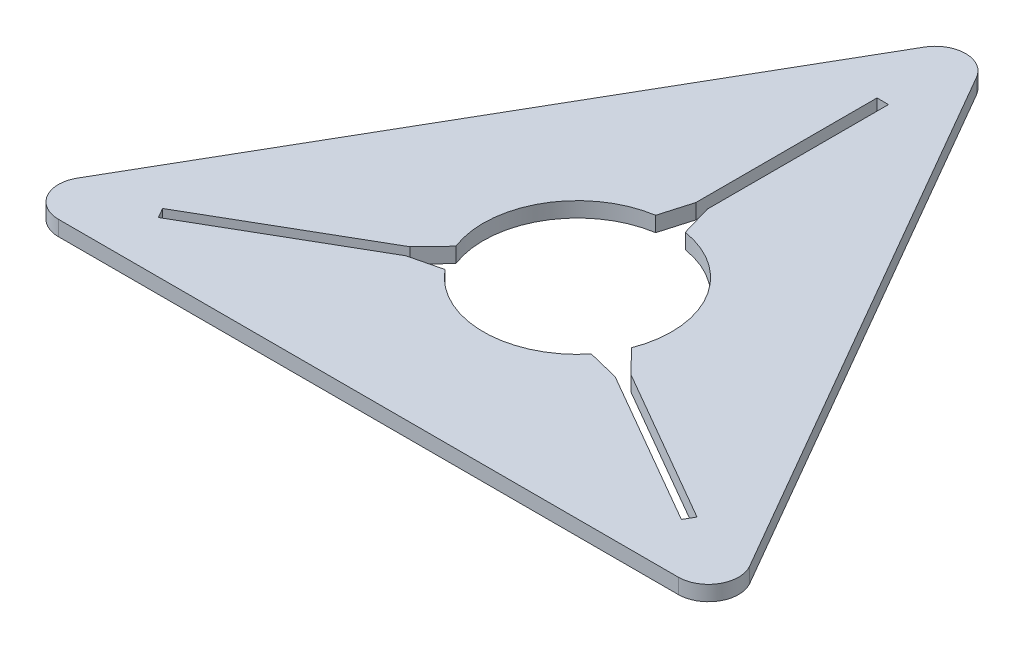
ISO-10303-21;
HEADER;
FILE_DESCRIPTION(('STEP AP214'),'2;1');
FILE_NAME('part.step','',(''),(''),'','','');
FILE_SCHEMA(('AUTOMOTIVE_DESIGN { 1 0 10303 214 1 1 1 1 }'));
ENDSEC;
DATA;
#1=APPLICATION_CONTEXT('core data for automotive mechanical design processes');
#2=APPLICATION_PROTOCOL_DEFINITION('international standard','automotive_design',2000,#1);
#3=PRODUCT_CONTEXT('',#1,'mechanical');
#4=PRODUCT('Part','Part','',(#3));
#5=PRODUCT_RELATED_PRODUCT_CATEGORY('part','',(#4));
#6=PRODUCT_DEFINITION_FORMATION('','',#4);
#7=PRODUCT_DEFINITION_CONTEXT('part definition',#1,'design');
#8=PRODUCT_DEFINITION('design','',#6,#7);
#9=PRODUCT_DEFINITION_SHAPE('','',#8);
#10=(LENGTH_UNIT() NAMED_UNIT(*) SI_UNIT(.MILLI.,.METRE.));
#11=(NAMED_UNIT(*) PLANE_ANGLE_UNIT() SI_UNIT($,.RADIAN.));
#12=(NAMED_UNIT(*) SI_UNIT($,.STERADIAN.) SOLID_ANGLE_UNIT());
#13=UNCERTAINTY_MEASURE_WITH_UNIT(LENGTH_MEASURE(1.E-05),#10,'distance_accuracy_value','');
#14=(GEOMETRIC_REPRESENTATION_CONTEXT(3) GLOBAL_UNCERTAINTY_ASSIGNED_CONTEXT((#13)) GLOBAL_UNIT_ASSIGNED_CONTEXT((#10,
#11,#12)) REPRESENTATION_CONTEXT('',''));
#15=CARTESIAN_POINT('',(0.,0.,0.));
#16=DIRECTION('',(0.,0.,1.));
#17=DIRECTION('',(1.,0.,0.));
#18=AXIS2_PLACEMENT_3D('',#15,#16,#17);
#19=CARTESIAN_POINT('',(0.,6.35,12.3986926256643));
#20=DIRECTION('',(0.,0.,1.));
#21=DIRECTION('',(1.,0.,0.));
#22=AXIS2_PLACEMENT_3D('',#19,#20,#21);
#23=PLANE('',#22);
#24=DIRECTION('',(-1.,0.,0.));
#25=VECTOR('',#24,1.);
#26=CARTESIAN_POINT('',(0.,0.,12.3986926256643));
#27=LINE('',#26,#25);
#28=CARTESIAN_POINT('',(205.250347928445,0.,12.3986926256643));
#29=VERTEX_POINT('',#28);
#30=CARTESIAN_POINT('',(-55.555561559305,0.,12.3986926256643));
#31=VERTEX_POINT('',#30);
#32=EDGE_CURVE('E347',#29,#31,#27,.T.);
#33=ORIENTED_EDGE('',*,*,#32,.F.);
#34=DIRECTION('',(0.,-1.,0.));
#35=VECTOR('',#34,1.);
#36=CARTESIAN_POINT('',(205.250347928445,6.35,12.3986926256643));
#37=LINE('',#36,#35);
#38=CARTESIAN_POINT('',(205.250347928445,6.35,12.3986926256643));
#39=VERTEX_POINT('',#38);
#40=EDGE_CURVE('E11',#29,#39,#37,.F.);
#41=ORIENTED_EDGE('',*,*,#40,.T.);
#42=DIRECTION('',(-1.,0.,0.));
#43=VECTOR('',#42,1.);
#44=CARTESIAN_POINT('',(0.,6.35,12.3986926256643));
#45=LINE('',#44,#43);
#46=CARTESIAN_POINT('',(-55.555561559305,6.35,12.3986926256643));
#47=VERTEX_POINT('',#46);
#48=EDGE_CURVE('E281',#39,#47,#45,.T.);
#49=ORIENTED_EDGE('',*,*,#48,.T.);
#50=DIRECTION('',(0.,-1.,0.));
#51=VECTOR('',#50,1.);
#52=CARTESIAN_POINT('',(-55.555561559305,6.35,12.3986926256643));
#53=LINE('',#52,#51);
#54=EDGE_CURVE('E54',#47,#31,#53,.T.);
#55=ORIENTED_EDGE('',*,*,#54,.T.);
#56=EDGE_LOOP('',(#33,#41,#49,#55));
#57=FACE_BOUND('',#56,.T.);
#58=ADVANCED_FACE('F45',(#57),#23,.T.);
#59=CARTESIAN_POINT('',(165.066753494658,6.35,-95.3013345643981));
#60=DIRECTION('',(0.866025403784439,0.,-0.5));
#61=DIRECTION('',(-0.5,0.,-0.866025403784439));
#62=AXIS2_PLACEMENT_3D('',#59,#60,#61);
#63=PLANE('',#62);
#64=DIRECTION('',(0.5,0.,0.866025403784439));
#65=VECTOR('',#64,1.);
#66=CARTESIAN_POINT('',(165.066753494658,0.,-95.3013345643981));
#67=LINE('',#66,#65);
#68=CARTESIAN_POINT('',(85.8459158126333,0.,-232.515850447831));
#69=VERTEX_POINT('',#68);
#70=CARTESIAN_POINT('',(216.248870556508,0.,-6.65130737433565));
#71=VERTEX_POINT('',#70);
#72=EDGE_CURVE('E351',#69,#71,#67,.T.);
#73=ORIENTED_EDGE('',*,*,#72,.F.);
#74=DIRECTION('',(0.,-1.,0.));
#75=VECTOR('',#74,1.);
#76=CARTESIAN_POINT('',(85.8459158126333,6.35,-232.515850447831));
#77=LINE('',#76,#75);
#78=CARTESIAN_POINT('',(85.8459158126333,6.35,-232.515850447831));
#79=VERTEX_POINT('',#78);
#80=EDGE_CURVE('E435',#69,#79,#77,.F.);
#81=ORIENTED_EDGE('',*,*,#80,.T.);
#82=DIRECTION('',(0.5,0.,0.866025403784439));
#83=VECTOR('',#82,1.);
#84=CARTESIAN_POINT('',(165.066753494658,6.35,-95.3013345643981));
#85=LINE('',#84,#83);
#86=CARTESIAN_POINT('',(216.248870556508,6.35,-6.65130737433565));
#87=VERTEX_POINT('',#86);
#88=EDGE_CURVE('E284',#79,#87,#85,.T.);
#89=ORIENTED_EDGE('',*,*,#88,.T.);
#90=DIRECTION('',(0.,-1.,0.));
#91=VECTOR('',#90,1.);
#92=CARTESIAN_POINT('',(216.248870556508,6.35,-6.65130737433567));
#93=LINE('',#92,#91);
#94=EDGE_CURVE('E431',#87,#71,#93,.T.);
#95=ORIENTED_EDGE('',*,*,#94,.T.);
#96=EDGE_LOOP('',(#73,#81,#89,#95));
#97=FACE_BOUND('',#96,.T.);
#98=ADVANCED_FACE('F458',(#97),#63,.T.);
#99=CARTESIAN_POINT('',(74.8473931845707,6.35,-75.5894883988338));
#100=DIRECTION('',(0.,-1.,0.));
#101=DIRECTION('',(0.,0.,-1.));
#102=AXIS2_PLACEMENT_3D('',#99,#100,#101);
#103=CYLINDRICAL_SURFACE('',#102,39.624);
#104=CARTESIAN_POINT('',(74.8473931845707,0.,-75.5894883988338));
#105=DIRECTION('',(0.,1.,0.));
#106=DIRECTION('',(0.,0.,1.));
#107=AXIS2_PLACEMENT_3D('',#104,#105,#106);
#108=CIRCLE('',#107,39.624);
#109=CARTESIAN_POINT('',(111.848445191791,0.,-61.4126225125013));
#110=VERTEX_POINT('',#109);
#111=CARTESIAN_POINT('',(81.0703931845701,0.,-114.721772347001));
#112=VERTEX_POINT('',#111);
#113=EDGE_CURVE('E212',#110,#112,#108,.T.);
#114=ORIENTED_EDGE('',*,*,#113,.F.);
#115=DIRECTION('',(0.,-1.,0.));
#116=VECTOR('',#115,1.);
#117=CARTESIAN_POINT('',(111.848445191791,6.35,-61.4126225125013));
#118=LINE('',#117,#116);
#119=CARTESIAN_POINT('',(111.848445191791,6.35,-61.4126225125013));
#120=VERTEX_POINT('',#119);
#121=EDGE_CURVE('E207',#120,#110,#118,.T.);
#122=ORIENTED_EDGE('',*,*,#121,.F.);
#123=CARTESIAN_POINT('',(74.8473931845707,6.35,-75.5894883988338));
#124=DIRECTION('',(0.,1.,0.));
#125=DIRECTION('',(0.,0.,1.));
#126=AXIS2_PLACEMENT_3D('',#123,#124,#125);
#127=CIRCLE('',#126,39.624);
#128=CARTESIAN_POINT('',(81.0703931845701,6.35,-114.721772347001));
#129=VERTEX_POINT('',#128);
#130=EDGE_CURVE('E210',#120,#129,#127,.T.);
#131=ORIENTED_EDGE('',*,*,#130,.T.);
#132=DIRECTION('',(0.,-1.,0.));
#133=VECTOR('',#132,1.);
#134=CARTESIAN_POINT('',(81.0703931845701,6.35,-114.721772347001));
#135=LINE('',#134,#133);
#136=EDGE_CURVE('E292',#129,#112,#135,.T.);
#137=ORIENTED_EDGE('',*,*,#136,.T.);
#138=EDGE_LOOP('',(#114,#122,#131,#137));
#139=FACE_BOUND('',#138,.T.);
#140=ADVANCED_FACE('F209',(#139),#103,.F.);
#141=CARTESIAN_POINT('',(88.9363889257709,6.35,-85.3011196003562));
#142=DIRECTION('',(-0.721702705632083,0.,0.692203152754544));
#143=DIRECTION('',(0.692203152754544,0.,0.721702705632083));
#144=AXIS2_PLACEMENT_3D('',#141,#142,#143);
#145=PLANE('',#144);
#146=DIRECTION('',(-0.692203152754544,0.,-0.721702705632083));
#147=VECTOR('',#146,1.);
#148=CARTESIAN_POINT('',(88.9363889257709,0.,-85.3011196003562));
#149=LINE('',#148,#147);
#150=CARTESIAN_POINT('',(121.304118036757,0.,-51.5539781988656));
#151=VERTEX_POINT('',#150);
#152=EDGE_CURVE('E295',#151,#110,#149,.T.);
#153=ORIENTED_EDGE('',*,*,#152,.F.);
#154=DIRECTION('',(0.,-1.,0.));
#155=VECTOR('',#154,1.);
#156=CARTESIAN_POINT('',(121.304118036757,6.35,-51.5539781988656));
#157=LINE('',#156,#155);
#158=CARTESIAN_POINT('',(121.304118036757,6.35,-51.5539781988656));
#159=VERTEX_POINT('',#158);
#160=EDGE_CURVE('E219',#159,#151,#157,.T.);
#161=ORIENTED_EDGE('',*,*,#160,.F.);
#162=DIRECTION('',(-0.692203152754544,0.,-0.721702705632083));
#163=VECTOR('',#162,1.);
#164=CARTESIAN_POINT('',(88.9363889257709,6.35,-85.3011196003562));
#165=LINE('',#164,#163);
#166=EDGE_CURVE('E224',#159,#120,#165,.T.);
#167=ORIENTED_EDGE('',*,*,#166,.T.);
#168=ORIENTED_EDGE('',*,*,#121,.T.);
#169=EDGE_LOOP('',(#153,#161,#167,#168));
#170=FACE_BOUND('',#169,.T.);
#171=ADVANCED_FACE('F233',(#170),#145,.T.);
#172=CARTESIAN_POINT('',(52.6495569023733,6.35,-91.1917075508982));
#173=DIRECTION('',(0.500000000000004,0.,-0.866025403784436));
#174=DIRECTION('',(-0.866025403784436,0.,-0.500000000000004));
#175=AXIS2_PLACEMENT_3D('',#172,#173,#174);
#176=PLANE('',#175);
#177=DIRECTION('',(0.866025403784436,0.,0.500000000000004));
#178=VECTOR('',#177,1.);
#179=CARTESIAN_POINT('',(52.6495569023733,0.,-91.1917075508982));
#180=LINE('',#179,#178);
#181=CARTESIAN_POINT('',(187.295253805131,0.,-13.4539781988654));
#182=VERTEX_POINT('',#181);
#183=EDGE_CURVE('E300',#151,#182,#180,.T.);
#184=ORIENTED_EDGE('',*,*,#183,.T.);
#185=DIRECTION('',(0.,-1.,0.));
#186=VECTOR('',#185,1.);
#187=CARTESIAN_POINT('',(187.295253805131,6.35,-13.4539781988654));
#188=LINE('',#187,#186);
#189=CARTESIAN_POINT('',(187.295253805131,6.35,-13.4539781988654));
#190=VERTEX_POINT('',#189);
#191=EDGE_CURVE('E410',#190,#182,#188,.T.);
#192=ORIENTED_EDGE('',*,*,#191,.F.);
#193=DIRECTION('',(0.866025403784436,0.,0.500000000000004));
#194=VECTOR('',#193,1.);
#195=CARTESIAN_POINT('',(52.6495569023733,6.35,-91.1917075508982));
#196=LINE('',#195,#194);
#197=EDGE_CURVE('E236',#159,#190,#196,.T.);
#198=ORIENTED_EDGE('',*,*,#197,.F.);
#199=ORIENTED_EDGE('',*,*,#160,.T.);
#200=EDGE_LOOP('',(#184,#192,#198,#199));
#201=FACE_BOUND('',#200,.T.);
#202=ADVANCED_FACE('F536',(#201),#176,.F.);
#203=CARTESIAN_POINT('',(134.645696902758,6.35,77.7377293520326));
#204=DIRECTION('',(0.866025403784438,0.,0.500000000000002));
#205=DIRECTION('',(0.500000000000002,0.,-0.866025403784438));
#206=AXIS2_PLACEMENT_3D('',#203,#204,#205);
#207=PLANE('',#206);
#208=DIRECTION('',(-0.500000000000002,0.,0.866025403784438));
#209=VECTOR('',#208,1.);
#210=CARTESIAN_POINT('',(134.645696902758,0.,77.7377293520326));
#211=LINE('',#210,#209);
#212=CARTESIAN_POINT('',(184.882253805131,0.,-9.27453960020171));
#213=VERTEX_POINT('',#212);
#214=EDGE_CURVE('E303',#182,#213,#211,.T.);
#215=ORIENTED_EDGE('',*,*,#214,.T.);
#216=DIRECTION('',(0.,-1.,0.));
#217=VECTOR('',#216,1.);
#218=CARTESIAN_POINT('',(184.882253805131,6.35,-9.27453960020171));
#219=LINE('',#218,#217);
#220=CARTESIAN_POINT('',(184.882253805131,6.35,-9.27453960020171));
#221=VERTEX_POINT('',#220);
#222=EDGE_CURVE('E406',#221,#213,#219,.T.);
#223=ORIENTED_EDGE('',*,*,#222,.F.);
#224=DIRECTION('',(-0.500000000000002,0.,0.866025403784438));
#225=VECTOR('',#224,1.);
#226=CARTESIAN_POINT('',(134.645696902758,6.35,77.7377293520326));
#227=LINE('',#226,#225);
#228=EDGE_CURVE('E239',#190,#221,#227,.T.);
#229=ORIENTED_EDGE('',*,*,#228,.F.);
#230=ORIENTED_EDGE('',*,*,#191,.T.);
#231=EDGE_LOOP('',(#215,#223,#229,#230));
#232=FACE_BOUND('',#231,.T.);
#233=ADVANCED_FACE('F532',(#232),#207,.F.);
#234=CARTESIAN_POINT('',(50.2365569023733,6.35,-87.0122689522346));
#235=DIRECTION('',(-0.500000000000004,0.,0.866025403784436));
#236=DIRECTION('',(0.866025403784436,0.,0.500000000000004));
#237=AXIS2_PLACEMENT_3D('',#234,#235,#236);
#238=PLANE('',#237);
#239=DIRECTION('',(-0.866025403784436,0.,-0.500000000000004));
#240=VECTOR('',#239,1.);
#241=CARTESIAN_POINT('',(50.2365569023733,0.,-87.0122689522346));
#242=LINE('',#241,#240);
#243=CARTESIAN_POINT('',(118.891118036757,0.,-47.3745396002022));
#244=VERTEX_POINT('',#243);
#245=EDGE_CURVE('E306',#213,#244,#242,.T.);
#246=ORIENTED_EDGE('',*,*,#245,.T.);
#247=DIRECTION('',(0.,-1.,0.));
#248=VECTOR('',#247,1.);
#249=CARTESIAN_POINT('',(118.891118036757,6.35,-47.3745396002022));
#250=LINE('',#249,#248);
#251=CARTESIAN_POINT('',(118.891118036757,6.35,-47.3745396002022));
#252=VERTEX_POINT('',#251);
#253=EDGE_CURVE('E402',#252,#244,#250,.T.);
#254=ORIENTED_EDGE('',*,*,#253,.F.);
#255=DIRECTION('',(-0.866025403784436,0.,-0.500000000000004));
#256=VECTOR('',#255,1.);
#257=CARTESIAN_POINT('',(50.2365569023733,6.35,-87.0122689522346));
#258=LINE('',#257,#256);
#259=EDGE_CURVE('E244',#221,#252,#258,.T.);
#260=ORIENTED_EDGE('',*,*,#259,.F.);
#261=ORIENTED_EDGE('',*,*,#222,.T.);
#262=EDGE_LOOP('',(#246,#254,#260,#261));
#263=FACE_BOUND('',#262,.T.);
#264=ADVANCED_FACE('F528',(#263),#238,.F.);
#265=CARTESIAN_POINT('',(17.7469771314453,6.35,-72.2268361991639));
#266=DIRECTION('',(-0.238614162049086,0.,0.971114453434616));
#267=DIRECTION('',(0.971114453434616,0.,0.238614162049086));
#268=AXIS2_PLACEMENT_3D('',#265,#266,#267);
#269=PLANE('',#268);
#270=DIRECTION('',(-0.971114453434616,0.,-0.238614162049086));
#271=VECTOR('',#270,1.);
#272=CARTESIAN_POINT('',(17.7469771314453,0.,-72.2268361991639));
#273=LINE('',#272,#271);
#274=CARTESIAN_POINT('',(105.625445191791,0.,-50.6340703370002));
#275=VERTEX_POINT('',#274);
#276=EDGE_CURVE('E309',#244,#275,#273,.T.);
#277=ORIENTED_EDGE('',*,*,#276,.T.);
#278=DIRECTION('',(0.,-1.,0.));
#279=VECTOR('',#278,1.);
#280=CARTESIAN_POINT('',(105.625445191791,6.35,-50.6340703370002));
#281=LINE('',#280,#279);
#282=CARTESIAN_POINT('',(105.625445191791,6.35,-50.6340703370002));
#283=VERTEX_POINT('',#282);
#284=EDGE_CURVE('E399',#283,#275,#281,.T.);
#285=ORIENTED_EDGE('',*,*,#284,.F.);
#286=DIRECTION('',(-0.971114453434616,0.,-0.238614162049086));
#287=VECTOR('',#286,1.);
#288=CARTESIAN_POINT('',(17.7469771314453,6.35,-72.2268361991639));
#289=LINE('',#288,#287);
#290=EDGE_CURVE('E247',#252,#283,#289,.T.);
#291=ORIENTED_EDGE('',*,*,#290,.F.);
#292=ORIENTED_EDGE('',*,*,#253,.T.);
#293=EDGE_LOOP('',(#277,#285,#291,#292));
#294=FACE_BOUND('',#293,.T.);
#295=ADVANCED_FACE('F525',(#294),#269,.F.);
#296=CARTESIAN_POINT('',(44.0693411773527,0.,-50.6340703369987));
#297=VERTEX_POINT('',#296);
#298=EDGE_CURVE('E297',#297,#275,#108,.T.);
#299=ORIENTED_EDGE('',*,*,#298,.F.);
#300=DIRECTION('',(0.,-1.,0.));
#301=VECTOR('',#300,1.);
#302=CARTESIAN_POINT('',(44.0693411773527,6.35,-50.6340703369987));
#303=LINE('',#302,#301);
#304=CARTESIAN_POINT('',(44.0693411773527,6.35,-50.6340703369987));
#305=VERTEX_POINT('',#304);
#306=EDGE_CURVE('E396',#305,#297,#303,.T.);
#307=ORIENTED_EDGE('',*,*,#306,.F.);
#308=EDGE_CURVE('E232',#305,#283,#127,.T.);
#309=ORIENTED_EDGE('',*,*,#308,.T.);
#310=ORIENTED_EDGE('',*,*,#284,.T.);
#311=EDGE_LOOP('',(#299,#307,#309,#310));
#312=FACE_BOUND('',#311,.T.);
#313=ADVANCED_FACE('F505',(#312),#103,.F.);
#314=CARTESIAN_POINT('',(-9.22384724441707,6.35,-37.5393115748278));
#315=DIRECTION('',(-0.23861416204907,0.,-0.97111445343462));
#316=DIRECTION('',(-0.97111445343462,0.,0.23861416204907));
#317=AXIS2_PLACEMENT_3D('',#314,#315,#316);
#318=PLANE('',#317);
#319=DIRECTION('',(0.97111445343462,0.,-0.23861416204907));
#320=VECTOR('',#319,1.);
#321=CARTESIAN_POINT('',(-9.22384724441707,0.,-37.5393115748278));
#322=LINE('',#321,#320);
#323=CARTESIAN_POINT('',(30.8036683323863,0.,-47.3745396002009));
#324=VERTEX_POINT('',#323);
#325=EDGE_CURVE('E313',#324,#297,#322,.T.);
#326=ORIENTED_EDGE('',*,*,#325,.F.);
#327=DIRECTION('',(0.,-1.,0.));
#328=VECTOR('',#327,1.);
#329=CARTESIAN_POINT('',(30.8036683323863,6.35,-47.3745396002009));
#330=LINE('',#329,#328);
#331=CARTESIAN_POINT('',(30.8036683323863,6.35,-47.3745396002009));
#332=VERTEX_POINT('',#331);
#333=EDGE_CURVE('E393',#332,#324,#330,.T.);
#334=ORIENTED_EDGE('',*,*,#333,.F.);
#335=DIRECTION('',(0.97111445343462,0.,-0.23861416204907));
#336=VECTOR('',#335,1.);
#337=CARTESIAN_POINT('',(-9.22384724441707,6.35,-37.5393115748278));
#338=LINE('',#337,#336);
#339=EDGE_CURVE('E250',#332,#305,#338,.T.);
#340=ORIENTED_EDGE('',*,*,#339,.T.);
#341=ORIENTED_EDGE('',*,*,#306,.T.);
#342=EDGE_LOOP('',(#326,#334,#340,#341));
#343=FACE_BOUND('',#342,.T.);
#344=ADVANCED_FACE('F520',(#343),#318,.T.);
#345=CARTESIAN_POINT('',(-12.8128603100864,6.35,-22.1925250473528));
#346=DIRECTION('',(0.499999999999992,0.,0.866025403784443));
#347=DIRECTION('',(0.866025403784443,0.,-0.499999999999992));
#348=AXIS2_PLACEMENT_3D('',#345,#346,#347);
#349=PLANE('',#348);
#350=DIRECTION('',(-0.866025403784443,0.,0.499999999999992));
#351=VECTOR('',#350,1.);
#352=CARTESIAN_POINT('',(-12.8128603100864,0.,-22.1925250473528));
#353=LINE('',#352,#351);
#354=CARTESIAN_POINT('',(-35.1874674359886,0.,-9.27453960020133));
#355=VERTEX_POINT('',#354);
#356=EDGE_CURVE('E317',#324,#355,#353,.T.);
#357=ORIENTED_EDGE('',*,*,#356,.T.);
#358=DIRECTION('',(0.,-1.,0.));
#359=VECTOR('',#358,1.);
#360=CARTESIAN_POINT('',(-35.1874674359886,6.35,-9.27453960020133));
#361=LINE('',#360,#359);
#362=CARTESIAN_POINT('',(-35.1874674359886,6.35,-9.27453960020133));
#363=VERTEX_POINT('',#362);
#364=EDGE_CURVE('E389',#363,#355,#361,.T.);
#365=ORIENTED_EDGE('',*,*,#364,.F.);
#366=DIRECTION('',(-0.866025403784443,0.,0.499999999999992));
#367=VECTOR('',#366,1.);
#368=CARTESIAN_POINT('',(-12.8128603100864,6.35,-22.1925250473528));
#369=LINE('',#368,#367);
#370=EDGE_CURVE('E254',#332,#363,#369,.T.);
#371=ORIENTED_EDGE('',*,*,#370,.F.);
#372=ORIENTED_EDGE('',*,*,#333,.T.);
#373=EDGE_LOOP('',(#357,#365,#371,#372));
#374=FACE_BOUND('',#373,.T.);
#375=ADVANCED_FACE('F516',(#374),#349,.F.);
#376=CARTESIAN_POINT('',(-22.3746071259023,6.35,12.9179854471514));
#377=DIRECTION('',(-0.866025403784445,0.,0.499999999999989));
#378=DIRECTION('',(0.499999999999989,0.,0.866025403784445));
#379=AXIS2_PLACEMENT_3D('',#376,#377,#378);
#380=PLANE('',#379);
#381=DIRECTION('',(-0.499999999999989,0.,-0.866025403784445));
#382=VECTOR('',#381,1.);
#383=CARTESIAN_POINT('',(-22.3746071259023,0.,12.9179854471514));
#384=LINE('',#383,#382);
#385=CARTESIAN_POINT('',(-37.6004674359885,0.,-13.4539781988651));
#386=VERTEX_POINT('',#385);
#387=EDGE_CURVE('E320',#355,#386,#384,.T.);
#388=ORIENTED_EDGE('',*,*,#387,.T.);
#389=DIRECTION('',(0.,-1.,0.));
#390=VECTOR('',#389,1.);
#391=CARTESIAN_POINT('',(-37.6004674359885,6.35,-13.4539781988651));
#392=LINE('',#391,#390);
#393=CARTESIAN_POINT('',(-37.6004674359885,6.35,-13.4539781988651));
#394=VERTEX_POINT('',#393);
#395=EDGE_CURVE('E385',#394,#386,#392,.T.);
#396=ORIENTED_EDGE('',*,*,#395,.F.);
#397=DIRECTION('',(-0.499999999999989,0.,-0.866025403784445));
#398=VECTOR('',#397,1.);
#399=CARTESIAN_POINT('',(-22.3746071259023,6.35,12.9179854471514));
#400=LINE('',#399,#398);
#401=EDGE_CURVE('E257',#363,#394,#400,.T.);
#402=ORIENTED_EDGE('',*,*,#401,.F.);
#403=ORIENTED_EDGE('',*,*,#364,.T.);
#404=EDGE_LOOP('',(#388,#396,#402,#403));
#405=FACE_BOUND('',#404,.T.);
#406=ADVANCED_FACE('F512',(#405),#380,.F.);
#407=CARTESIAN_POINT('',(-15.2258603100863,6.35,-26.3719636460165));
#408=DIRECTION('',(-0.499999999999992,0.,-0.866025403784443));
#409=DIRECTION('',(-0.866025403784443,0.,0.499999999999992));
#410=AXIS2_PLACEMENT_3D('',#407,#408,#409);
#411=PLANE('',#410);
#412=DIRECTION('',(0.866025403784443,0.,-0.499999999999992));
#413=VECTOR('',#412,1.);
#414=CARTESIAN_POINT('',(-15.2258603100863,0.,-26.3719636460165));
#415=LINE('',#414,#413);
#416=CARTESIAN_POINT('',(28.390668332386,0.,-51.5539781988644));
#417=VERTEX_POINT('',#416);
#418=EDGE_CURVE('E323',#386,#417,#415,.T.);
#419=ORIENTED_EDGE('',*,*,#418,.T.);
#420=DIRECTION('',(0.,-1.,0.));
#421=VECTOR('',#420,1.);
#422=CARTESIAN_POINT('',(28.390668332386,6.35,-51.5539781988644));
#423=LINE('',#422,#421);
#424=CARTESIAN_POINT('',(28.390668332386,6.35,-51.5539781988644));
#425=VERTEX_POINT('',#424);
#426=EDGE_CURVE('E381',#425,#417,#423,.T.);
#427=ORIENTED_EDGE('',*,*,#426,.F.);
#428=DIRECTION('',(0.866025403784443,0.,-0.499999999999992));
#429=VECTOR('',#428,1.);
#430=CARTESIAN_POINT('',(-15.2258603100863,6.35,-26.3719636460165));
#431=LINE('',#430,#429);
#432=EDGE_CURVE('E260',#394,#425,#431,.T.);
#433=ORIENTED_EDGE('',*,*,#432,.F.);
#434=ORIENTED_EDGE('',*,*,#395,.T.);
#435=EDGE_LOOP('',(#419,#427,#433,#434));
#436=FACE_BOUND('',#435,.T.);
#437=ADVANCED_FACE('F508',(#436),#411,.F.);
#438=CARTESIAN_POINT('',(-10.9671416114982,6.35,-10.5188603852275));
#439=DIRECTION('',(-0.721702705632072,0.,-0.692203152754555));
#440=DIRECTION('',(-0.692203152754555,0.,0.721702705632073));
#441=AXIS2_PLACEMENT_3D('',#438,#439,#440);
#442=PLANE('',#441);
#443=DIRECTION('',(0.692203152754555,0.,-0.721702705632073));
#444=VECTOR('',#443,1.);
#445=CARTESIAN_POINT('',(-10.9671416114982,0.,-10.5188603852275));
#446=LINE('',#445,#444);
#447=CARTESIAN_POINT('',(37.8463411773528,0.,-61.4126225124999));
#448=VERTEX_POINT('',#447);
#449=EDGE_CURVE('E326',#417,#448,#446,.T.);
#450=ORIENTED_EDGE('',*,*,#449,.T.);
#451=DIRECTION('',(0.,-1.,0.));
#452=VECTOR('',#451,1.);
#453=CARTESIAN_POINT('',(37.8463411773528,6.35,-61.4126225124999));
#454=LINE('',#453,#452);
#455=CARTESIAN_POINT('',(37.8463411773528,6.35,-61.4126225124999));
#456=VERTEX_POINT('',#455);
#457=EDGE_CURVE('E378',#456,#448,#454,.T.);
#458=ORIENTED_EDGE('',*,*,#457,.F.);
#459=DIRECTION('',(0.692203152754555,0.,-0.721702705632073));
#460=VECTOR('',#459,1.);
#461=CARTESIAN_POINT('',(-10.9671416114982,6.35,-10.5188603852275));
#462=LINE('',#461,#460);
#463=EDGE_CURVE('E263',#425,#456,#462,.T.);
#464=ORIENTED_EDGE('',*,*,#463,.F.);
#465=ORIENTED_EDGE('',*,*,#426,.T.);
#466=EDGE_LOOP('',(#450,#458,#464,#465));
#467=FACE_BOUND('',#466,.T.);
#468=ADVANCED_FACE('F503',(#467),#442,.F.);
#469=CARTESIAN_POINT('',(68.6243931845701,0.,-114.721772347001));
#470=VERTEX_POINT('',#469);
#471=EDGE_CURVE('E296',#470,#448,#108,.T.);
#472=ORIENTED_EDGE('',*,*,#471,.F.);
#473=DIRECTION('',(0.,-1.,0.));
#474=VECTOR('',#473,1.);
#475=CARTESIAN_POINT('',(68.6243931845701,6.35,-114.721772347001));
#476=LINE('',#475,#474);
#477=CARTESIAN_POINT('',(68.6243931845701,6.35,-114.721772347001));
#478=VERTEX_POINT('',#477);
#479=EDGE_CURVE('E375',#478,#470,#476,.T.);
#480=ORIENTED_EDGE('',*,*,#479,.F.);
#481=EDGE_CURVE('E231',#478,#456,#127,.T.);
#482=ORIENTED_EDGE('',*,*,#481,.T.);
#483=ORIENTED_EDGE('',*,*,#457,.T.);
#484=EDGE_LOOP('',(#472,#480,#482,#483));
#485=FACE_BOUND('',#484,.T.);
#486=ADVANCED_FACE('F499',(#485),#103,.F.);
#487=CARTESIAN_POINT('',(32.5585480955035,6.35,9.45619857693318));
#488=DIRECTION('',(0.960316867681159,0.,0.27891130068007));
#489=DIRECTION('',(0.27891130068007,0.,-0.960316867681159));
#490=AXIS2_PLACEMENT_3D('',#487,#488,#489);
#491=PLANE('',#490);
#492=DIRECTION('',(-0.27891130068007,0.,0.960316867681159));
#493=VECTOR('',#492,1.);
#494=CARTESIAN_POINT('',(32.5585480955035,0.,9.45619857693318));
#495=LINE('',#494,#493);
#496=CARTESIAN_POINT('',(72.4343931845701,0.,-127.839947397434));
#497=VERTEX_POINT('',#496);
#498=EDGE_CURVE('E330',#497,#470,#495,.T.);
#499=ORIENTED_EDGE('',*,*,#498,.F.);
#500=DIRECTION('',(0.,-1.,0.));
#501=VECTOR('',#500,1.);
#502=CARTESIAN_POINT('',(72.4343931845701,6.35,-127.839947397434));
#503=LINE('',#502,#501);
#504=CARTESIAN_POINT('',(72.4343931845701,6.35,-127.839947397434));
#505=VERTEX_POINT('',#504);
#506=EDGE_CURVE('E372',#505,#497,#503,.T.);
#507=ORIENTED_EDGE('',*,*,#506,.F.);
#508=DIRECTION('',(-0.27891130068007,0.,0.960316867681159));
#509=VECTOR('',#508,1.);
#510=CARTESIAN_POINT('',(32.5585480955035,6.35,9.45619857693318));
#511=LINE('',#510,#509);
#512=EDGE_CURVE('E266',#505,#478,#511,.T.);
#513=ORIENTED_EDGE('',*,*,#512,.T.);
#514=ORIENTED_EDGE('',*,*,#479,.T.);
#515=EDGE_LOOP('',(#499,#507,#513,#514));
#516=FACE_BOUND('',#515,.T.);
#517=ADVANCED_FACE('F495',(#516),#491,.T.);
#518=CARTESIAN_POINT('',(72.4343931845701,6.35,0.));
#519=DIRECTION('',(-1.,0.,0.));
#520=DIRECTION('',(0.,0.,1.));
#521=AXIS2_PLACEMENT_3D('',#518,#519,#520);
#522=PLANE('',#521);
#523=DIRECTION('',(0.,0.,-1.));
#524=VECTOR('',#523,1.);
#525=CARTESIAN_POINT('',(72.4343931845701,0.,0.));
#526=LINE('',#525,#524);
#527=CARTESIAN_POINT('',(72.4343931845701,0.,-204.039947397434));
#528=VERTEX_POINT('',#527);
#529=EDGE_CURVE('E334',#497,#528,#526,.T.);
#530=ORIENTED_EDGE('',*,*,#529,.T.);
#531=DIRECTION('',(0.,-1.,0.));
#532=VECTOR('',#531,1.);
#533=CARTESIAN_POINT('',(72.4343931845701,6.35,-204.039947397434));
#534=LINE('',#533,#532);
#535=CARTESIAN_POINT('',(72.4343931845701,6.35,-204.039947397434));
#536=VERTEX_POINT('',#535);
#537=EDGE_CURVE('E368',#536,#528,#534,.T.);
#538=ORIENTED_EDGE('',*,*,#537,.F.);
#539=DIRECTION('',(0.,0.,-1.));
#540=VECTOR('',#539,1.);
#541=CARTESIAN_POINT('',(72.4343931845701,6.35,0.));
#542=LINE('',#541,#540);
#543=EDGE_CURVE('E270',#505,#536,#542,.T.);
#544=ORIENTED_EDGE('',*,*,#543,.F.);
#545=ORIENTED_EDGE('',*,*,#506,.T.);
#546=EDGE_LOOP('',(#530,#538,#544,#545));
#547=FACE_BOUND('',#546,.T.);
#548=ADVANCED_FACE('F491',(#547),#522,.F.);
#549=CARTESIAN_POINT('',(0.,6.35,-204.039947397434));
#550=DIRECTION('',(0.,0.,-1.));
#551=DIRECTION('',(-1.,0.,0.));
#552=AXIS2_PLACEMENT_3D('',#549,#550,#551);
#553=PLANE('',#552);
#554=DIRECTION('',(1.,0.,0.));
#555=VECTOR('',#554,1.);
#556=CARTESIAN_POINT('',(0.,0.,-204.039947397434));
#557=LINE('',#556,#555);
#558=CARTESIAN_POINT('',(77.2603931845701,0.,-204.039947397434));
#559=VERTEX_POINT('',#558);
#560=EDGE_CURVE('E337',#528,#559,#557,.T.);
#561=ORIENTED_EDGE('',*,*,#560,.T.);
#562=DIRECTION('',(0.,-1.,0.));
#563=VECTOR('',#562,1.);
#564=CARTESIAN_POINT('',(77.2603931845701,6.35,-204.039947397434));
#565=LINE('',#564,#563);
#566=CARTESIAN_POINT('',(77.2603931845701,6.35,-204.039947397434));
#567=VERTEX_POINT('',#566);
#568=EDGE_CURVE('E364',#567,#559,#565,.T.);
#569=ORIENTED_EDGE('',*,*,#568,.F.);
#570=DIRECTION('',(1.,0.,0.));
#571=VECTOR('',#570,1.);
#572=CARTESIAN_POINT('',(0.,6.35,-204.039947397434));
#573=LINE('',#572,#571);
#574=EDGE_CURVE('E273',#536,#567,#573,.T.);
#575=ORIENTED_EDGE('',*,*,#574,.F.);
#576=ORIENTED_EDGE('',*,*,#537,.T.);
#577=EDGE_LOOP('',(#561,#569,#575,#576));
#578=FACE_BOUND('',#577,.T.);
#579=ADVANCED_FACE('F487',(#578),#553,.F.);
#580=CARTESIAN_POINT('',(77.2603931845701,6.35,0.));
#581=DIRECTION('',(1.,0.,0.));
#582=DIRECTION('',(0.,0.,-1.));
#583=AXIS2_PLACEMENT_3D('',#580,#581,#582);
#584=PLANE('',#583);
#585=DIRECTION('',(0.,0.,1.));
#586=VECTOR('',#585,1.);
#587=CARTESIAN_POINT('',(77.2603931845701,0.,0.));
#588=LINE('',#587,#586);
#589=CARTESIAN_POINT('',(77.2603931845701,0.,-127.839947397434));
#590=VERTEX_POINT('',#589);
#591=EDGE_CURVE('E340',#559,#590,#588,.T.);
#592=ORIENTED_EDGE('',*,*,#591,.T.);
#593=DIRECTION('',(0.,-1.,0.));
#594=VECTOR('',#593,1.);
#595=CARTESIAN_POINT('',(77.2603931845701,6.35,-127.839947397434));
#596=LINE('',#595,#594);
#597=CARTESIAN_POINT('',(77.2603931845701,6.35,-127.839947397434));
#598=VERTEX_POINT('',#597);
#599=EDGE_CURVE('E360',#598,#590,#596,.T.);
#600=ORIENTED_EDGE('',*,*,#599,.F.);
#601=DIRECTION('',(0.,0.,1.));
#602=VECTOR('',#601,1.);
#603=CARTESIAN_POINT('',(77.2603931845701,6.35,0.));
#604=LINE('',#603,#602);
#605=EDGE_CURVE('E276',#567,#598,#604,.T.);
#606=ORIENTED_EDGE('',*,*,#605,.F.);
#607=ORIENTED_EDGE('',*,*,#568,.T.);
#608=EDGE_LOOP('',(#592,#600,#606,#607));
#609=FACE_BOUND('',#608,.T.);
#610=ADVANCED_FACE('F483',(#609),#584,.F.);
#611=CARTESIAN_POINT('',(105.49125425691,6.35,-30.63853601386));
#612=DIRECTION('',(0.960316867681159,0.,-0.278911300680068));
#613=DIRECTION('',(-0.278911300680068,0.,-0.960316867681159));
#614=AXIS2_PLACEMENT_3D('',#611,#612,#613);
#615=PLANE('',#614);
#616=DIRECTION('',(0.278911300680068,0.,0.960316867681159));
#617=VECTOR('',#616,1.);
#618=CARTESIAN_POINT('',(105.49125425691,0.,-30.63853601386));
#619=LINE('',#618,#617);
#620=EDGE_CURVE('E343',#590,#112,#619,.T.);
#621=ORIENTED_EDGE('',*,*,#620,.T.);
#622=ORIENTED_EDGE('',*,*,#136,.F.);
#623=DIRECTION('',(0.278911300680068,0.,0.960316867681159));
#624=VECTOR('',#623,1.);
#625=CARTESIAN_POINT('',(105.49125425691,6.35,-30.63853601386));
#626=LINE('',#625,#624);
#627=EDGE_CURVE('E226',#598,#129,#626,.T.);
#628=ORIENTED_EDGE('',*,*,#627,.F.);
#629=ORIENTED_EDGE('',*,*,#599,.T.);
#630=EDGE_LOOP('',(#621,#622,#628,#629));
#631=FACE_BOUND('',#630,.T.);
#632=ADVANCED_FACE('F480',(#631),#615,.F.);
#633=CARTESIAN_POINT('',(-52.795663717802,6.35,-30.4815906595183));
#634=DIRECTION('',(-0.866025403784436,0.,-0.500000000000004));
#635=DIRECTION('',(-0.500000000000004,0.,0.866025403784437));
#636=AXIS2_PLACEMENT_3D('',#633,#634,#635);
#637=PLANE('',#636);
#638=DIRECTION('',(0.500000000000004,0.,-0.866025403784436));
#639=VECTOR('',#638,1.);
#640=CARTESIAN_POINT('',(-52.795663717802,6.35,-30.4815906595183));
#641=LINE('',#640,#639);
#642=CARTESIAN_POINT('',(-66.5540841873673,6.35,-6.65130737433571));
#643=VERTEX_POINT('',#642);
#644=CARTESIAN_POINT('',(63.8488705565086,6.35,-232.515850447831));
#645=VERTEX_POINT('',#644);
#646=EDGE_CURVE('E288',#643,#645,#641,.T.);
#647=ORIENTED_EDGE('',*,*,#646,.T.);
#648=DIRECTION('',(0.,-1.,0.));
#649=VECTOR('',#648,1.);
#650=CARTESIAN_POINT('',(63.8488705565086,6.35,-232.515850447831));
#651=LINE('',#650,#649);
#652=CARTESIAN_POINT('',(63.8488705565086,0.,-232.515850447831));
#653=VERTEX_POINT('',#652);
#654=EDGE_CURVE('E418',#645,#653,#651,.T.);
#655=ORIENTED_EDGE('',*,*,#654,.T.);
#656=DIRECTION('',(0.500000000000004,0.,-0.866025403784436));
#657=VECTOR('',#656,1.);
#658=CARTESIAN_POINT('',(-52.795663717802,0.,-30.4815906595183));
#659=LINE('',#658,#657);
#660=CARTESIAN_POINT('',(-66.5540841873673,0.,-6.65130737433571));
#661=VERTEX_POINT('',#660);
#662=EDGE_CURVE('E229',#661,#653,#659,.T.);
#663=ORIENTED_EDGE('',*,*,#662,.F.);
#664=DIRECTION('',(0.,-1.,0.));
#665=VECTOR('',#664,1.);
#666=CARTESIAN_POINT('',(-66.5540841873673,6.35,-6.6513073743357));
#667=LINE('',#666,#665);
#668=EDGE_CURVE('E218',#661,#643,#667,.F.);
#669=ORIENTED_EDGE('',*,*,#668,.T.);
#670=EDGE_LOOP('',(#647,#655,#663,#669));
#671=FACE_BOUND('',#670,.T.);
#672=ADVANCED_FACE('F466',(#671),#637,.T.);
#673=CARTESIAN_POINT('',(0.,6.35,0.));
#674=DIRECTION('',(0.,1.,0.));
#675=DIRECTION('',(0.,0.,1.));
#676=AXIS2_PLACEMENT_3D('',#673,#674,#675);
#677=PLANE('',#676);
#678=ORIENTED_EDGE('',*,*,#130,.F.);
#679=ORIENTED_EDGE('',*,*,#166,.F.);
#680=ORIENTED_EDGE('',*,*,#197,.T.);
#681=ORIENTED_EDGE('',*,*,#228,.T.);
#682=ORIENTED_EDGE('',*,*,#259,.T.);
#683=ORIENTED_EDGE('',*,*,#290,.T.);
#684=ORIENTED_EDGE('',*,*,#308,.F.);
#685=ORIENTED_EDGE('',*,*,#339,.F.);
#686=ORIENTED_EDGE('',*,*,#370,.T.);
#687=ORIENTED_EDGE('',*,*,#401,.T.);
#688=ORIENTED_EDGE('',*,*,#432,.T.);
#689=ORIENTED_EDGE('',*,*,#463,.T.);
#690=ORIENTED_EDGE('',*,*,#481,.F.);
#691=ORIENTED_EDGE('',*,*,#512,.F.);
#692=ORIENTED_EDGE('',*,*,#543,.T.);
#693=ORIENTED_EDGE('',*,*,#574,.T.);
#694=ORIENTED_EDGE('',*,*,#605,.T.);
#695=ORIENTED_EDGE('',*,*,#627,.T.);
#696=EDGE_LOOP('',(#678,#679,#680,#681,#682,#683,#684,#685,#686,#687,#688,#689,#690,#691,#692,
#693,#694,#695));
#697=FACE_BOUND('',#696,.T.);
#698=ORIENTED_EDGE('',*,*,#88,.F.);
#699=CARTESIAN_POINT('',(74.8473931845709,6.35,-226.165850447831));
#700=DIRECTION('',(0.,1.,0.));
#701=DIRECTION('',(0.,0.,1.));
#702=AXIS2_PLACEMENT_3D('',#699,#700,#701);
#703=CIRCLE('',#702,12.7);
#704=EDGE_CURVE('E443',#79,#645,#703,.T.);
#705=ORIENTED_EDGE('',*,*,#704,.T.);
#706=ORIENTED_EDGE('',*,*,#646,.F.);
#707=CARTESIAN_POINT('',(-55.555561559305,6.35,-0.301307374335655));
#708=DIRECTION('',(0.,1.,0.));
#709=DIRECTION('',(0.,0.,1.));
#710=AXIS2_PLACEMENT_3D('',#707,#708,#709);
#711=CIRCLE('',#710,12.7);
#712=EDGE_CURVE('E61',#643,#47,#711,.T.);
#713=ORIENTED_EDGE('',*,*,#712,.T.);
#714=ORIENTED_EDGE('',*,*,#48,.F.);
#715=CARTESIAN_POINT('',(205.250347928445,6.35,-0.301307374335674));
#716=DIRECTION('',(0.,1.,0.));
#717=DIRECTION('',(0.,0.,1.));
#718=AXIS2_PLACEMENT_3D('',#715,#716,#717);
#719=CIRCLE('',#718,12.7);
#720=EDGE_CURVE('E440',#39,#87,#719,.T.);
#721=ORIENTED_EDGE('',*,*,#720,.T.);
#722=EDGE_LOOP('',(#698,#705,#706,#713,#714,#721));
#723=FACE_BOUND('',#722,.T.);
#724=ADVANCED_FACE('F223',(#697,#723),#677,.T.);
#725=CARTESIAN_POINT('',(0.,0.,0.));
#726=DIRECTION('',(0.,1.,0.));
#727=DIRECTION('',(0.,0.,1.));
#728=AXIS2_PLACEMENT_3D('',#725,#726,#727);
#729=PLANE('',#728);
#730=ORIENTED_EDGE('',*,*,#113,.T.);
#731=ORIENTED_EDGE('',*,*,#620,.F.);
#732=ORIENTED_EDGE('',*,*,#591,.F.);
#733=ORIENTED_EDGE('',*,*,#560,.F.);
#734=ORIENTED_EDGE('',*,*,#529,.F.);
#735=ORIENTED_EDGE('',*,*,#498,.T.);
#736=ORIENTED_EDGE('',*,*,#471,.T.);
#737=ORIENTED_EDGE('',*,*,#449,.F.);
#738=ORIENTED_EDGE('',*,*,#418,.F.);
#739=ORIENTED_EDGE('',*,*,#387,.F.);
#740=ORIENTED_EDGE('',*,*,#356,.F.);
#741=ORIENTED_EDGE('',*,*,#325,.T.);
#742=ORIENTED_EDGE('',*,*,#298,.T.);
#743=ORIENTED_EDGE('',*,*,#276,.F.);
#744=ORIENTED_EDGE('',*,*,#245,.F.);
#745=ORIENTED_EDGE('',*,*,#214,.F.);
#746=ORIENTED_EDGE('',*,*,#183,.F.);
#747=ORIENTED_EDGE('',*,*,#152,.T.);
#748=EDGE_LOOP('',(#730,#731,#732,#733,#734,#735,#736,#737,#738,#739,#740,#741,#742,#743,#744,
#745,#746,#747));
#749=FACE_BOUND('',#748,.T.);
#750=ORIENTED_EDGE('',*,*,#662,.T.);
#751=CARTESIAN_POINT('',(74.8473931845709,0.,-226.165850447831));
#752=DIRECTION('',(0.,1.,0.));
#753=DIRECTION('',(0.,0.,1.));
#754=AXIS2_PLACEMENT_3D('',#751,#752,#753);
#755=CIRCLE('',#754,12.7);
#756=EDGE_CURVE('E428',#653,#69,#755,.F.);
#757=ORIENTED_EDGE('',*,*,#756,.T.);
#758=ORIENTED_EDGE('',*,*,#72,.T.);
#759=CARTESIAN_POINT('',(205.250347928445,0.,-0.301307374335674));
#760=DIRECTION('',(0.,1.,0.));
#761=DIRECTION('',(0.,0.,1.));
#762=AXIS2_PLACEMENT_3D('',#759,#760,#761);
#763=CIRCLE('',#762,12.7);
#764=EDGE_CURVE('E425',#71,#29,#763,.F.);
#765=ORIENTED_EDGE('',*,*,#764,.T.);
#766=ORIENTED_EDGE('',*,*,#32,.T.);
#767=CARTESIAN_POINT('',(-55.555561559305,0.,-0.301307374335655));
#768=DIRECTION('',(0.,1.,0.));
#769=DIRECTION('',(0.,0.,1.));
#770=AXIS2_PLACEMENT_3D('',#767,#768,#769);
#771=CIRCLE('',#770,12.7);
#772=EDGE_CURVE('E422',#31,#661,#771,.F.);
#773=ORIENTED_EDGE('',*,*,#772,.T.);
#774=EDGE_LOOP('',(#750,#757,#758,#765,#766,#773));
#775=FACE_BOUND('',#774,.T.);
#776=ADVANCED_FACE('F450',(#749,#775),#729,.F.);
#777=CARTESIAN_POINT('',(74.8473931845709,6.35,-226.165850447831));
#778=DIRECTION('',(0.,-1.,0.));
#779=DIRECTION('',(0.,0.,-1.));
#780=AXIS2_PLACEMENT_3D('',#777,#778,#779);
#781=CYLINDRICAL_SURFACE('',#780,12.7);
#782=ORIENTED_EDGE('',*,*,#704,.F.);
#783=ORIENTED_EDGE('',*,*,#80,.F.);
#784=ORIENTED_EDGE('',*,*,#756,.F.);
#785=ORIENTED_EDGE('',*,*,#654,.F.);
#786=EDGE_LOOP('',(#782,#783,#784,#785));
#787=FACE_BOUND('',#786,.T.);
#788=ADVANCED_FACE('F464',(#787),#781,.T.);
#789=CARTESIAN_POINT('',(205.250347928445,6.35,-0.301307374335674));
#790=DIRECTION('',(0.,-1.,0.));
#791=DIRECTION('',(0.,0.,-1.));
#792=AXIS2_PLACEMENT_3D('',#789,#790,#791);
#793=CYLINDRICAL_SURFACE('',#792,12.7);
#794=ORIENTED_EDGE('',*,*,#720,.F.);
#795=ORIENTED_EDGE('',*,*,#40,.F.);
#796=ORIENTED_EDGE('',*,*,#764,.F.);
#797=ORIENTED_EDGE('',*,*,#94,.F.);
#798=EDGE_LOOP('',(#794,#795,#796,#797));
#799=FACE_BOUND('',#798,.T.);
#800=ADVANCED_FACE('F456',(#799),#793,.T.);
#801=CARTESIAN_POINT('',(-55.555561559305,6.35,-0.301307374335655));
#802=DIRECTION('',(0.,-1.,0.));
#803=DIRECTION('',(0.,0.,-1.));
#804=AXIS2_PLACEMENT_3D('',#801,#802,#803);
#805=CYLINDRICAL_SURFACE('',#804,12.7);
#806=ORIENTED_EDGE('',*,*,#712,.F.);
#807=ORIENTED_EDGE('',*,*,#668,.F.);
#808=ORIENTED_EDGE('',*,*,#772,.F.);
#809=ORIENTED_EDGE('',*,*,#54,.F.);
#810=EDGE_LOOP('',(#806,#807,#808,#809));
#811=FACE_BOUND('',#810,.T.);
#812=ADVANCED_FACE('F47',(#811),#805,.T.);
#813=CLOSED_SHELL('',(#58,#98,#140,#171,#202,#233,#264,#295,#313,#344,#375,#406,#437,#468,#486,
#517,#548,#579,#610,#632,#672,#724,#776,#788,#800,#812));
#814=MANIFOLD_SOLID_BREP('B2',#813);
#815=ADVANCED_BREP_SHAPE_REPRESENTATION('',(#18,#814),#14);
#816=SHAPE_DEFINITION_REPRESENTATION(#9,#815);
ENDSEC;
END-ISO-10303-21;
